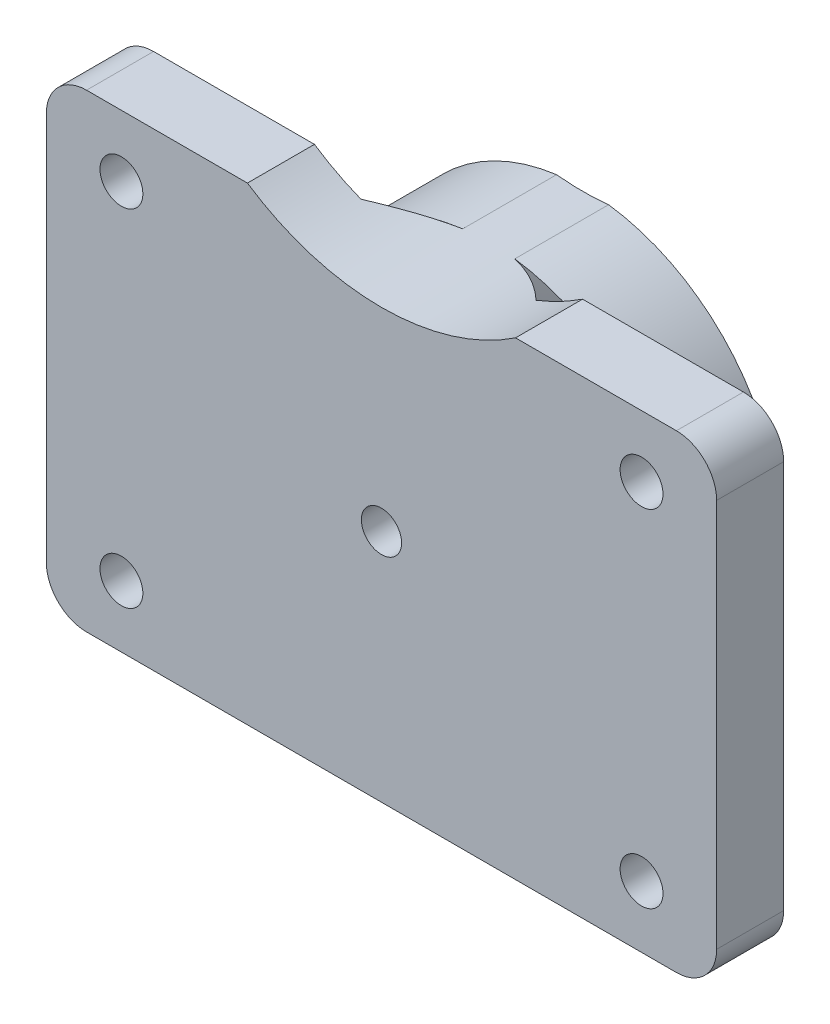
ISO-10303-21;
HEADER;
FILE_DESCRIPTION(('STEP AP214'),'2;1');
FILE_NAME('part.step','',(''),(''),'','','');
FILE_SCHEMA(('AUTOMOTIVE_DESIGN { 1 0 10303 214 1 1 1 1 }'));
ENDSEC;
DATA;
#1=APPLICATION_CONTEXT('core data for automotive mechanical design processes');
#2=APPLICATION_PROTOCOL_DEFINITION('international standard','automotive_design',2000,#1);
#3=PRODUCT_CONTEXT('',#1,'mechanical');
#4=PRODUCT('Part','Part','',(#3));
#5=PRODUCT_RELATED_PRODUCT_CATEGORY('part','',(#4));
#6=PRODUCT_DEFINITION_FORMATION('','',#4);
#7=PRODUCT_DEFINITION_CONTEXT('part definition',#1,'design');
#8=PRODUCT_DEFINITION('design','',#6,#7);
#9=PRODUCT_DEFINITION_SHAPE('','',#8);
#10=(LENGTH_UNIT() NAMED_UNIT(*) SI_UNIT(.MILLI.,.METRE.));
#11=(NAMED_UNIT(*) PLANE_ANGLE_UNIT() SI_UNIT($,.RADIAN.));
#12=(NAMED_UNIT(*) SI_UNIT($,.STERADIAN.) SOLID_ANGLE_UNIT());
#13=UNCERTAINTY_MEASURE_WITH_UNIT(LENGTH_MEASURE(1.E-05),#10,'distance_accuracy_value','');
#14=(GEOMETRIC_REPRESENTATION_CONTEXT(3) GLOBAL_UNCERTAINTY_ASSIGNED_CONTEXT((#13)) GLOBAL_UNIT_ASSIGNED_CONTEXT((#10,
#11,#12)) REPRESENTATION_CONTEXT('',''));
#15=CARTESIAN_POINT('',(0.,0.,0.));
#16=DIRECTION('',(0.,0.,1.));
#17=DIRECTION('',(1.,0.,0.));
#18=AXIS2_PLACEMENT_3D('',#15,#16,#17);
#19=CARTESIAN_POINT('',(-22.,17.5,2.5));
#20=DIRECTION('',(0.,-1.,0.));
#21=DIRECTION('',(0.,0.,-1.));
#22=AXIS2_PLACEMENT_3D('',#19,#20,#21);
#23=PLANE('',#22);
#24=DIRECTION('',(-1.,0.,0.));
#25=VECTOR('',#24,1.);
#26=CARTESIAN_POINT('',(-22.,17.5,-2.5));
#27=LINE('',#26,#25);
#28=CARTESIAN_POINT('',(22.,17.5,-2.5));
#29=VERTEX_POINT('',#28);
#30=CARTESIAN_POINT('',(10.,17.5,-2.5));
#31=VERTEX_POINT('',#30);
#32=EDGE_CURVE('E182',#29,#31,#27,.T.);
#33=ORIENTED_EDGE('',*,*,#32,.T.);
#34=DIRECTION('',(0.,0.,1.));
#35=VECTOR('',#34,1.);
#36=CARTESIAN_POINT('',(10.,17.5,-22.5));
#37=LINE('',#36,#35);
#38=CARTESIAN_POINT('',(10.,17.5,2.5));
#39=VERTEX_POINT('',#38);
#40=EDGE_CURVE('E374',#31,#39,#37,.T.);
#41=ORIENTED_EDGE('',*,*,#40,.T.);
#42=DIRECTION('',(-1.,0.,0.));
#43=VECTOR('',#42,1.);
#44=CARTESIAN_POINT('',(-22.,17.5,2.5));
#45=LINE('',#44,#43);
#46=CARTESIAN_POINT('',(22.,17.5,2.5));
#47=VERTEX_POINT('',#46);
#48=EDGE_CURVE('E142',#47,#39,#45,.T.);
#49=ORIENTED_EDGE('',*,*,#48,.F.);
#50=DIRECTION('',(0.,0.,-1.));
#51=VECTOR('',#50,1.);
#52=CARTESIAN_POINT('',(22.,17.5,2.5));
#53=LINE('',#52,#51);
#54=EDGE_CURVE('E153',#47,#29,#53,.T.);
#55=ORIENTED_EDGE('',*,*,#54,.T.);
#56=EDGE_LOOP('',(#33,#41,#49,#55));
#57=FACE_BOUND('',#56,.T.);
#58=ADVANCED_FACE('F39',(#57),#23,.F.);
#59=CARTESIAN_POINT('',(-22.,-14.5,2.5));
#60=DIRECTION('',(0.,0.,-1.));
#61=DIRECTION('',(-1.,0.,0.));
#62=AXIS2_PLACEMENT_3D('',#59,#60,#61);
#63=PLANE('',#62);
#64=CARTESIAN_POINT('',(0.,0.,2.5));
#65=DIRECTION('',(0.,0.,-1.));
#66=DIRECTION('',(-1.,0.,0.));
#67=AXIS2_PLACEMENT_3D('',#64,#65,#66);
#68=CIRCLE('',#67,1.5);
#69=CARTESIAN_POINT('',(-1.5,0.,2.5));
#70=VERTEX_POINT('',#69);
#71=EDGE_CURVE('E351',#70,#70,#68,.T.);
#72=ORIENTED_EDGE('',*,*,#71,.T.);
#73=EDGE_LOOP('',(#72));
#74=FACE_BOUND('',#73,.T.);
#75=ORIENTED_EDGE('',*,*,#48,.T.);
#76=CARTESIAN_POINT('',(0.,32.4666295470958,2.5));
#77=DIRECTION('',(0.,0.,1.));
#78=DIRECTION('',(1.,0.,0.));
#79=AXIS2_PLACEMENT_3D('',#76,#77,#78);
#80=CIRCLE('',#79,18.);
#81=CARTESIAN_POINT('',(-10.,17.5,2.5));
#82=VERTEX_POINT('',#81);
#83=EDGE_CURVE('E138',#82,#39,#80,.T.);
#84=ORIENTED_EDGE('',*,*,#83,.F.);
#85=CARTESIAN_POINT('',(-22.,17.5,2.5));
#86=VERTEX_POINT('',#85);
#87=EDGE_CURVE('E128',#82,#86,#45,.T.);
#88=ORIENTED_EDGE('',*,*,#87,.T.);
#89=CARTESIAN_POINT('',(-22.,14.5,2.5));
#90=DIRECTION('',(0.,0.,1.));
#91=DIRECTION('',(-1.,0.,0.));
#92=AXIS2_PLACEMENT_3D('',#89,#90,#91);
#93=CIRCLE('',#92,3.);
#94=CARTESIAN_POINT('',(-25.,14.5,2.5));
#95=VERTEX_POINT('',#94);
#96=EDGE_CURVE('E134',#86,#95,#93,.T.);
#97=ORIENTED_EDGE('',*,*,#96,.T.);
#98=DIRECTION('',(0.,-1.,0.));
#99=VECTOR('',#98,1.);
#100=CARTESIAN_POINT('',(-25.,-14.5,2.5));
#101=LINE('',#100,#99);
#102=CARTESIAN_POINT('',(-25.,-14.5,2.5));
#103=VERTEX_POINT('',#102);
#104=EDGE_CURVE('E70',#95,#103,#101,.T.);
#105=ORIENTED_EDGE('',*,*,#104,.T.);
#106=CARTESIAN_POINT('',(-22.,-14.5,2.5));
#107=DIRECTION('',(0.,0.,1.));
#108=DIRECTION('',(-1.,0.,0.));
#109=AXIS2_PLACEMENT_3D('',#106,#107,#108);
#110=CIRCLE('',#109,3.);
#111=CARTESIAN_POINT('',(-22.,-17.5,2.5));
#112=VERTEX_POINT('',#111);
#113=EDGE_CURVE('E191',#103,#112,#110,.T.);
#114=ORIENTED_EDGE('',*,*,#113,.T.);
#115=DIRECTION('',(1.,0.,0.));
#116=VECTOR('',#115,1.);
#117=CARTESIAN_POINT('',(-22.,-17.5,2.5));
#118=LINE('',#117,#116);
#119=CARTESIAN_POINT('',(22.,-17.5,2.5));
#120=VERTEX_POINT('',#119);
#121=EDGE_CURVE('E112',#112,#120,#118,.T.);
#122=ORIENTED_EDGE('',*,*,#121,.T.);
#123=CARTESIAN_POINT('',(22.,-14.5,2.5));
#124=DIRECTION('',(0.,0.,1.));
#125=DIRECTION('',(1.,0.,0.));
#126=AXIS2_PLACEMENT_3D('',#123,#124,#125);
#127=CIRCLE('',#126,3.);
#128=CARTESIAN_POINT('',(25.,-14.5,2.5));
#129=VERTEX_POINT('',#128);
#130=EDGE_CURVE('E286',#120,#129,#127,.T.);
#131=ORIENTED_EDGE('',*,*,#130,.T.);
#132=DIRECTION('',(0.,1.,0.));
#133=VECTOR('',#132,1.);
#134=CARTESIAN_POINT('',(25.,-14.5,2.5));
#135=LINE('',#134,#133);
#136=CARTESIAN_POINT('',(25.,14.5,2.5));
#137=VERTEX_POINT('',#136);
#138=EDGE_CURVE('E298',#129,#137,#135,.T.);
#139=ORIENTED_EDGE('',*,*,#138,.T.);
#140=CARTESIAN_POINT('',(22.,14.5,2.5));
#141=DIRECTION('',(0.,0.,1.));
#142=DIRECTION('',(-1.,0.,0.));
#143=AXIS2_PLACEMENT_3D('',#140,#141,#142);
#144=CIRCLE('',#143,3.);
#145=EDGE_CURVE('E143',#137,#47,#144,.T.);
#146=ORIENTED_EDGE('',*,*,#145,.T.);
#147=EDGE_LOOP('',(#75,#84,#88,#97,#105,#114,#122,#131,#139,#146));
#148=FACE_BOUND('',#147,.T.);
#149=CARTESIAN_POINT('',(-19.4,12.9,2.5));
#150=DIRECTION('',(0.,0.,1.));
#151=DIRECTION('',(1.,0.,0.));
#152=AXIS2_PLACEMENT_3D('',#149,#150,#151);
#153=CIRCLE('',#152,1.6);
#154=CARTESIAN_POINT('',(-17.8,12.9,2.5));
#155=VERTEX_POINT('',#154);
#156=EDGE_CURVE('E170',#155,#155,#153,.T.);
#157=ORIENTED_EDGE('',*,*,#156,.F.);
#158=EDGE_LOOP('',(#157));
#159=FACE_BOUND('',#158,.T.);
#160=CARTESIAN_POINT('',(19.4,12.9,2.5));
#161=DIRECTION('',(0.,0.,1.));
#162=DIRECTION('',(-1.,0.,0.));
#163=AXIS2_PLACEMENT_3D('',#160,#161,#162);
#164=CIRCLE('',#163,1.6);
#165=CARTESIAN_POINT('',(17.8,12.9,2.5));
#166=VERTEX_POINT('',#165);
#167=EDGE_CURVE('E312',#166,#166,#164,.T.);
#168=ORIENTED_EDGE('',*,*,#167,.F.);
#169=EDGE_LOOP('',(#168));
#170=FACE_BOUND('',#169,.T.);
#171=CARTESIAN_POINT('',(19.4,-12.9,2.5));
#172=DIRECTION('',(0.,0.,1.));
#173=DIRECTION('',(1.,0.,0.));
#174=AXIS2_PLACEMENT_3D('',#171,#172,#173);
#175=CIRCLE('',#174,1.6);
#176=CARTESIAN_POINT('',(21.,-12.9,2.5));
#177=VERTEX_POINT('',#176);
#178=EDGE_CURVE('E320',#177,#177,#175,.T.);
#179=ORIENTED_EDGE('',*,*,#178,.F.);
#180=EDGE_LOOP('',(#179));
#181=FACE_BOUND('',#180,.T.);
#182=CARTESIAN_POINT('',(-19.3999999999999,-12.9,2.5));
#183=DIRECTION('',(0.,0.,1.));
#184=DIRECTION('',(-1.,0.,0.));
#185=AXIS2_PLACEMENT_3D('',#182,#183,#184);
#186=CIRCLE('',#185,1.6);
#187=CARTESIAN_POINT('',(-20.9999999999999,-12.9,2.5));
#188=VERTEX_POINT('',#187);
#189=EDGE_CURVE('E328',#188,#188,#186,.T.);
#190=ORIENTED_EDGE('',*,*,#189,.F.);
#191=EDGE_LOOP('',(#190));
#192=FACE_BOUND('',#191,.T.);
#193=ADVANCED_FACE('F131',(#74,#148,#159,#170,#181,#192),#63,.F.);
#194=CARTESIAN_POINT('',(-22.,-14.5,-2.5));
#195=DIRECTION('',(0.,0.,-1.));
#196=DIRECTION('',(-1.,0.,0.));
#197=AXIS2_PLACEMENT_3D('',#194,#195,#196);
#198=PLANE('',#197);
#199=CARTESIAN_POINT('',(0.,32.4666295470958,-2.5));
#200=DIRECTION('',(0.,0.,-1.));
#201=DIRECTION('',(-1.,0.,0.));
#202=AXIS2_PLACEMENT_3D('',#199,#200,#201);
#203=CIRCLE('',#202,18.);
#204=CARTESIAN_POINT('',(6.53367846649108,15.6942997835683,-2.5));
#205=VERTEX_POINT('',#204);
#206=EDGE_CURVE('E356',#31,#205,#203,.T.);
#207=ORIENTED_EDGE('',*,*,#206,.F.);
#208=ORIENTED_EDGE('',*,*,#32,.F.);
#209=CARTESIAN_POINT('',(22.,14.5,-2.5));
#210=DIRECTION('',(0.,0.,1.));
#211=DIRECTION('',(-1.,0.,0.));
#212=AXIS2_PLACEMENT_3D('',#209,#210,#211);
#213=CIRCLE('',#212,3.);
#214=CARTESIAN_POINT('',(25.,14.5,-2.5));
#215=VERTEX_POINT('',#214);
#216=EDGE_CURVE('E179',#215,#29,#213,.T.);
#217=ORIENTED_EDGE('',*,*,#216,.F.);
#218=DIRECTION('',(0.,1.,0.));
#219=VECTOR('',#218,1.);
#220=CARTESIAN_POINT('',(25.,-14.5,-2.5));
#221=LINE('',#220,#219);
#222=CARTESIAN_POINT('',(25.,-14.5,-2.5));
#223=VERTEX_POINT('',#222);
#224=EDGE_CURVE('E176',#223,#215,#221,.T.);
#225=ORIENTED_EDGE('',*,*,#224,.F.);
#226=CARTESIAN_POINT('',(22.,-14.5,-2.5));
#227=DIRECTION('',(0.,0.,1.));
#228=DIRECTION('',(1.,0.,0.));
#229=AXIS2_PLACEMENT_3D('',#226,#227,#228);
#230=CIRCLE('',#229,3.);
#231=CARTESIAN_POINT('',(22.,-17.5,-2.5));
#232=VERTEX_POINT('',#231);
#233=EDGE_CURVE('E173',#232,#223,#230,.T.);
#234=ORIENTED_EDGE('',*,*,#233,.F.);
#235=DIRECTION('',(1.,0.,0.));
#236=VECTOR('',#235,1.);
#237=CARTESIAN_POINT('',(-22.,-17.5,-2.5));
#238=LINE('',#237,#236);
#239=CARTESIAN_POINT('',(-22.,-17.5,-2.5));
#240=VERTEX_POINT('',#239);
#241=EDGE_CURVE('E169',#240,#232,#238,.T.);
#242=ORIENTED_EDGE('',*,*,#241,.F.);
#243=CARTESIAN_POINT('',(-22.,-14.5,-2.5));
#244=DIRECTION('',(0.,0.,1.));
#245=DIRECTION('',(-1.,0.,0.));
#246=AXIS2_PLACEMENT_3D('',#243,#244,#245);
#247=CIRCLE('',#246,3.);
#248=CARTESIAN_POINT('',(-25.,-14.5,-2.5));
#249=VERTEX_POINT('',#248);
#250=EDGE_CURVE('E165',#249,#240,#247,.T.);
#251=ORIENTED_EDGE('',*,*,#250,.F.);
#252=DIRECTION('',(0.,-1.,0.));
#253=VECTOR('',#252,1.);
#254=CARTESIAN_POINT('',(-25.,-14.5,-2.5));
#255=LINE('',#254,#253);
#256=CARTESIAN_POINT('',(-25.,14.5,-2.5));
#257=VERTEX_POINT('',#256);
#258=EDGE_CURVE('E103',#257,#249,#255,.T.);
#259=ORIENTED_EDGE('',*,*,#258,.F.);
#260=CARTESIAN_POINT('',(-22.,14.5,-2.5));
#261=DIRECTION('',(0.,0.,1.));
#262=DIRECTION('',(-1.,0.,0.));
#263=AXIS2_PLACEMENT_3D('',#260,#261,#262);
#264=CIRCLE('',#263,3.);
#265=CARTESIAN_POINT('',(-22.,17.5,-2.5));
#266=VERTEX_POINT('',#265);
#267=EDGE_CURVE('E186',#266,#257,#264,.T.);
#268=ORIENTED_EDGE('',*,*,#267,.F.);
#269=CARTESIAN_POINT('',(-10.,17.5,-2.5));
#270=VERTEX_POINT('',#269);
#271=EDGE_CURVE('E149',#270,#266,#27,.T.);
#272=ORIENTED_EDGE('',*,*,#271,.F.);
#273=CARTESIAN_POINT('',(-6.53367846649108,15.6942997835683,-2.5));
#274=VERTEX_POINT('',#273);
#275=EDGE_CURVE('E364',#274,#270,#203,.T.);
#276=ORIENTED_EDGE('',*,*,#275,.F.);
#277=CARTESIAN_POINT('',(0.,0.,-2.5));
#278=DIRECTION('',(0.,0.,-1.));
#279=DIRECTION('',(-1.,0.,0.));
#280=AXIS2_PLACEMENT_3D('',#277,#278,#279);
#281=CIRCLE('',#280,17.);
#282=EDGE_CURVE('E214',#205,#274,#281,.T.);
#283=ORIENTED_EDGE('',*,*,#282,.F.);
#284=EDGE_LOOP('',(#207,#208,#217,#225,#234,#242,#251,#259,#268,#272,#276,#283));
#285=FACE_BOUND('',#284,.T.);
#286=CARTESIAN_POINT('',(19.4,-12.9,-2.5));
#287=DIRECTION('',(0.,0.,1.));
#288=DIRECTION('',(1.,0.,0.));
#289=AXIS2_PLACEMENT_3D('',#286,#287,#288);
#290=CIRCLE('',#289,1.6);
#291=CARTESIAN_POINT('',(21.,-12.9,-2.5));
#292=VERTEX_POINT('',#291);
#293=EDGE_CURVE('E324',#292,#292,#290,.T.);
#294=ORIENTED_EDGE('',*,*,#293,.T.);
#295=EDGE_LOOP('',(#294));
#296=FACE_BOUND('',#295,.T.);
#297=CARTESIAN_POINT('',(-19.4,12.9,-2.5));
#298=DIRECTION('',(0.,0.,1.));
#299=DIRECTION('',(1.,0.,0.));
#300=AXIS2_PLACEMENT_3D('',#297,#298,#299);
#301=CIRCLE('',#300,1.6);
#302=CARTESIAN_POINT('',(-17.8,12.9,-2.5));
#303=VERTEX_POINT('',#302);
#304=EDGE_CURVE('E308',#303,#303,#301,.T.);
#305=ORIENTED_EDGE('',*,*,#304,.T.);
#306=EDGE_LOOP('',(#305));
#307=FACE_BOUND('',#306,.T.);
#308=CARTESIAN_POINT('',(19.4,12.9,-2.5));
#309=DIRECTION('',(0.,0.,1.));
#310=DIRECTION('',(-1.,0.,0.));
#311=AXIS2_PLACEMENT_3D('',#308,#309,#310);
#312=CIRCLE('',#311,1.6);
#313=CARTESIAN_POINT('',(17.8,12.9,-2.5));
#314=VERTEX_POINT('',#313);
#315=EDGE_CURVE('E316',#314,#314,#312,.T.);
#316=ORIENTED_EDGE('',*,*,#315,.T.);
#317=EDGE_LOOP('',(#316));
#318=FACE_BOUND('',#317,.T.);
#319=CARTESIAN_POINT('',(-19.3999999999999,-12.9,-2.5));
#320=DIRECTION('',(0.,0.,1.));
#321=DIRECTION('',(-1.,0.,0.));
#322=AXIS2_PLACEMENT_3D('',#319,#320,#321);
#323=CIRCLE('',#322,1.6);
#324=CARTESIAN_POINT('',(-20.9999999999999,-12.9,-2.5));
#325=VERTEX_POINT('',#324);
#326=EDGE_CURVE('E332',#325,#325,#323,.T.);
#327=ORIENTED_EDGE('',*,*,#326,.T.);
#328=EDGE_LOOP('',(#327));
#329=FACE_BOUND('',#328,.T.);
#330=ADVANCED_FACE('F243',(#285,#296,#307,#318,#329),#198,.T.);
#331=CARTESIAN_POINT('',(-22.,-14.5,2.5));
#332=DIRECTION('',(0.,0.,-1.));
#333=DIRECTION('',(-1.,0.,0.));
#334=AXIS2_PLACEMENT_3D('',#331,#332,#333);
#335=CYLINDRICAL_SURFACE('',#334,3.);
#336=ORIENTED_EDGE('',*,*,#250,.T.);
#337=DIRECTION('',(0.,0.,-1.));
#338=VECTOR('',#337,1.);
#339=CARTESIAN_POINT('',(-22.,-17.5,2.5));
#340=LINE('',#339,#338);
#341=EDGE_CURVE('E211',#112,#240,#340,.T.);
#342=ORIENTED_EDGE('',*,*,#341,.F.);
#343=ORIENTED_EDGE('',*,*,#113,.F.);
#344=DIRECTION('',(0.,0.,-1.));
#345=VECTOR('',#344,1.);
#346=CARTESIAN_POINT('',(-25.,-14.5,2.5));
#347=LINE('',#346,#345);
#348=EDGE_CURVE('E161',#103,#249,#347,.T.);
#349=ORIENTED_EDGE('',*,*,#348,.T.);
#350=EDGE_LOOP('',(#336,#342,#343,#349));
#351=FACE_BOUND('',#350,.T.);
#352=ADVANCED_FACE('F41',(#351),#335,.T.);
#353=CARTESIAN_POINT('',(-22.,-17.5,2.5));
#354=DIRECTION('',(0.,1.,0.));
#355=DIRECTION('',(0.,0.,1.));
#356=AXIS2_PLACEMENT_3D('',#353,#354,#355);
#357=PLANE('',#356);
#358=ORIENTED_EDGE('',*,*,#241,.T.);
#359=DIRECTION('',(0.,0.,-1.));
#360=VECTOR('',#359,1.);
#361=CARTESIAN_POINT('',(22.,-17.5,2.5));
#362=LINE('',#361,#360);
#363=EDGE_CURVE('E207',#120,#232,#362,.T.);
#364=ORIENTED_EDGE('',*,*,#363,.F.);
#365=ORIENTED_EDGE('',*,*,#121,.F.);
#366=ORIENTED_EDGE('',*,*,#341,.T.);
#367=EDGE_LOOP('',(#358,#364,#365,#366));
#368=FACE_BOUND('',#367,.T.);
#369=ADVANCED_FACE('F273',(#368),#357,.F.);
#370=CARTESIAN_POINT('',(22.,-14.5,2.5));
#371=DIRECTION('',(0.,0.,-1.));
#372=DIRECTION('',(-1.,0.,0.));
#373=AXIS2_PLACEMENT_3D('',#370,#371,#372);
#374=CYLINDRICAL_SURFACE('',#373,3.);
#375=ORIENTED_EDGE('',*,*,#233,.T.);
#376=DIRECTION('',(0.,0.,-1.));
#377=VECTOR('',#376,1.);
#378=CARTESIAN_POINT('',(25.,-14.5,2.5));
#379=LINE('',#378,#377);
#380=EDGE_CURVE('E203',#129,#223,#379,.T.);
#381=ORIENTED_EDGE('',*,*,#380,.F.);
#382=ORIENTED_EDGE('',*,*,#130,.F.);
#383=ORIENTED_EDGE('',*,*,#363,.T.);
#384=EDGE_LOOP('',(#375,#381,#382,#383));
#385=FACE_BOUND('',#384,.T.);
#386=ADVANCED_FACE('F268',(#385),#374,.T.);
#387=CARTESIAN_POINT('',(25.,-14.5,2.5));
#388=DIRECTION('',(-1.,0.,0.));
#389=DIRECTION('',(0.,0.,1.));
#390=AXIS2_PLACEMENT_3D('',#387,#388,#389);
#391=PLANE('',#390);
#392=ORIENTED_EDGE('',*,*,#224,.T.);
#393=DIRECTION('',(0.,0.,-1.));
#394=VECTOR('',#393,1.);
#395=CARTESIAN_POINT('',(25.,14.5,2.5));
#396=LINE('',#395,#394);
#397=EDGE_CURVE('E199',#137,#215,#396,.T.);
#398=ORIENTED_EDGE('',*,*,#397,.F.);
#399=ORIENTED_EDGE('',*,*,#138,.F.);
#400=ORIENTED_EDGE('',*,*,#380,.T.);
#401=EDGE_LOOP('',(#392,#398,#399,#400));
#402=FACE_BOUND('',#401,.T.);
#403=ADVANCED_FACE('F263',(#402),#391,.F.);
#404=CARTESIAN_POINT('',(22.,14.5,2.5));
#405=DIRECTION('',(0.,0.,-1.));
#406=DIRECTION('',(-1.,0.,0.));
#407=AXIS2_PLACEMENT_3D('',#404,#405,#406);
#408=CYLINDRICAL_SURFACE('',#407,3.);
#409=ORIENTED_EDGE('',*,*,#216,.T.);
#410=ORIENTED_EDGE('',*,*,#54,.F.);
#411=ORIENTED_EDGE('',*,*,#145,.F.);
#412=ORIENTED_EDGE('',*,*,#397,.T.);
#413=EDGE_LOOP('',(#409,#410,#411,#412));
#414=FACE_BOUND('',#413,.T.);
#415=ADVANCED_FACE('F257',(#414),#408,.T.);
#416=ORIENTED_EDGE('',*,*,#87,.F.);
#417=DIRECTION('',(0.,0.,1.));
#418=VECTOR('',#417,1.);
#419=CARTESIAN_POINT('',(-10.,17.5,-22.5));
#420=LINE('',#419,#418);
#421=EDGE_CURVE('E373',#270,#82,#420,.T.);
#422=ORIENTED_EDGE('',*,*,#421,.F.);
#423=ORIENTED_EDGE('',*,*,#271,.T.);
#424=DIRECTION('',(0.,0.,-1.));
#425=VECTOR('',#424,1.);
#426=CARTESIAN_POINT('',(-22.,17.5,2.5));
#427=LINE('',#426,#425);
#428=EDGE_CURVE('E146',#86,#266,#427,.T.);
#429=ORIENTED_EDGE('',*,*,#428,.F.);
#430=EDGE_LOOP('',(#416,#422,#423,#429));
#431=FACE_BOUND('',#430,.T.);
#432=ADVANCED_FACE('F147',(#431),#23,.F.);
#433=CARTESIAN_POINT('',(-22.,14.5,2.5));
#434=DIRECTION('',(0.,0.,-1.));
#435=DIRECTION('',(-1.,0.,0.));
#436=AXIS2_PLACEMENT_3D('',#433,#434,#435);
#437=CYLINDRICAL_SURFACE('',#436,3.);
#438=ORIENTED_EDGE('',*,*,#267,.T.);
#439=DIRECTION('',(0.,0.,-1.));
#440=VECTOR('',#439,1.);
#441=CARTESIAN_POINT('',(-25.,14.5,2.5));
#442=LINE('',#441,#440);
#443=EDGE_CURVE('E154',#95,#257,#442,.T.);
#444=ORIENTED_EDGE('',*,*,#443,.F.);
#445=ORIENTED_EDGE('',*,*,#96,.F.);
#446=ORIENTED_EDGE('',*,*,#428,.T.);
#447=EDGE_LOOP('',(#438,#444,#445,#446));
#448=FACE_BOUND('',#447,.T.);
#449=ADVANCED_FACE('F156',(#448),#437,.T.);
#450=CARTESIAN_POINT('',(-25.,-14.5,2.5));
#451=DIRECTION('',(1.,0.,0.));
#452=DIRECTION('',(0.,0.,-1.));
#453=AXIS2_PLACEMENT_3D('',#450,#451,#452);
#454=PLANE('',#453);
#455=ORIENTED_EDGE('',*,*,#258,.T.);
#456=ORIENTED_EDGE('',*,*,#348,.F.);
#457=ORIENTED_EDGE('',*,*,#104,.F.);
#458=ORIENTED_EDGE('',*,*,#443,.T.);
#459=EDGE_LOOP('',(#455,#456,#457,#458));
#460=FACE_BOUND('',#459,.T.);
#461=ADVANCED_FACE('F262',(#460),#454,.F.);
#462=CARTESIAN_POINT('',(-19.4,12.9,2.5));
#463=DIRECTION('',(0.,0.,-1.));
#464=DIRECTION('',(-1.,0.,0.));
#465=AXIS2_PLACEMENT_3D('',#462,#463,#464);
#466=CYLINDRICAL_SURFACE('',#465,1.6);
#467=ORIENTED_EDGE('',*,*,#156,.T.);
#468=EDGE_LOOP('',(#467));
#469=FACE_BOUND('',#468,.T.);
#470=ORIENTED_EDGE('',*,*,#304,.F.);
#471=EDGE_LOOP('',(#470));
#472=FACE_BOUND('',#471,.T.);
#473=ADVANCED_FACE('F415',(#469,#472),#466,.F.);
#474=CARTESIAN_POINT('',(19.4,12.9,2.5));
#475=DIRECTION('',(0.,0.,-1.));
#476=DIRECTION('',(-1.,0.,0.));
#477=AXIS2_PLACEMENT_3D('',#474,#475,#476);
#478=CYLINDRICAL_SURFACE('',#477,1.6);
#479=ORIENTED_EDGE('',*,*,#167,.T.);
#480=EDGE_LOOP('',(#479));
#481=FACE_BOUND('',#480,.T.);
#482=ORIENTED_EDGE('',*,*,#315,.F.);
#483=EDGE_LOOP('',(#482));
#484=FACE_BOUND('',#483,.T.);
#485=ADVANCED_FACE('F420',(#481,#484),#478,.F.);
#486=CARTESIAN_POINT('',(19.4,-12.9,2.5));
#487=DIRECTION('',(0.,0.,-1.));
#488=DIRECTION('',(-1.,0.,0.));
#489=AXIS2_PLACEMENT_3D('',#486,#487,#488);
#490=CYLINDRICAL_SURFACE('',#489,1.6);
#491=ORIENTED_EDGE('',*,*,#178,.T.);
#492=EDGE_LOOP('',(#491));
#493=FACE_BOUND('',#492,.T.);
#494=ORIENTED_EDGE('',*,*,#293,.F.);
#495=EDGE_LOOP('',(#494));
#496=FACE_BOUND('',#495,.T.);
#497=ADVANCED_FACE('F427',(#493,#496),#490,.F.);
#498=CARTESIAN_POINT('',(-19.3999999999999,-12.9,2.5));
#499=DIRECTION('',(0.,0.,-1.));
#500=DIRECTION('',(-1.,0.,0.));
#501=AXIS2_PLACEMENT_3D('',#498,#499,#500);
#502=CYLINDRICAL_SURFACE('',#501,1.6);
#503=ORIENTED_EDGE('',*,*,#189,.T.);
#504=EDGE_LOOP('',(#503));
#505=FACE_BOUND('',#504,.T.);
#506=ORIENTED_EDGE('',*,*,#326,.F.);
#507=EDGE_LOOP('',(#506));
#508=FACE_BOUND('',#507,.T.);
#509=ADVANCED_FACE('F431',(#505,#508),#502,.F.);
#510=CARTESIAN_POINT('',(0.,0.,7.41758007255311));
#511=DIRECTION('',(0.,0.,1.));
#512=DIRECTION('',(1.,0.,0.));
#513=AXIS2_PLACEMENT_3D('',#510,#511,#512);
#514=CYLINDRICAL_SURFACE('',#513,8.2);
#515=CARTESIAN_POINT('',(0.,0.,-2.5));
#516=DIRECTION('',(0.,0.,-1.));
#517=DIRECTION('',(-1.,0.,0.));
#518=AXIS2_PLACEMENT_3D('',#515,#516,#517);
#519=CIRCLE('',#518,8.2);
#520=CARTESIAN_POINT('',(-8.2,0.,-2.5));
#521=VERTEX_POINT('',#520);
#522=EDGE_CURVE('E218',#521,#521,#519,.F.);
#523=ORIENTED_EDGE('',*,*,#522,.T.);
#524=EDGE_LOOP('',(#523));
#525=FACE_BOUND('',#524,.T.);
#526=CARTESIAN_POINT('',(0.,0.,-12.5));
#527=DIRECTION('',(0.,0.,1.));
#528=DIRECTION('',(1.,0.,0.));
#529=AXIS2_PLACEMENT_3D('',#526,#527,#528);
#530=CIRCLE('',#529,8.2);
#531=CARTESIAN_POINT('',(8.2,0.,-12.5));
#532=VERTEX_POINT('',#531);
#533=EDGE_CURVE('E336',#532,#532,#530,.T.);
#534=ORIENTED_EDGE('',*,*,#533,.F.);
#535=EDGE_LOOP('',(#534));
#536=FACE_BOUND('',#535,.T.);
#537=ADVANCED_FACE('F435',(#525,#536),#514,.F.);
#538=CARTESIAN_POINT('',(8.2,0.,-12.5));
#539=DIRECTION('',(0.,0.,-1.));
#540=DIRECTION('',(-1.,0.,0.));
#541=AXIS2_PLACEMENT_3D('',#538,#539,#540);
#542=PLANE('',#541);
#543=CARTESIAN_POINT('',(0.,32.4666295470958,-12.5));
#544=DIRECTION('',(0.,0.,-1.));
#545=DIRECTION('',(-1.,0.,0.));
#546=AXIS2_PLACEMENT_3D('',#543,#544,#545);
#547=CIRCLE('',#546,18.);
#548=CARTESIAN_POINT('',(1.93977114231603,14.5714545572993,-12.5));
#549=VERTEX_POINT('',#548);
#550=CARTESIAN_POINT('',(-1.93977114231603,14.5714545572993,-12.5));
#551=VERTEX_POINT('',#550);
#552=EDGE_CURVE('E368',#549,#551,#547,.T.);
#553=ORIENTED_EDGE('',*,*,#552,.F.);
#554=CARTESIAN_POINT('',(0.,0.,-12.5));
#555=DIRECTION('',(0.,0.,1.));
#556=DIRECTION('',(1.,0.,0.));
#557=AXIS2_PLACEMENT_3D('',#554,#555,#556);
#558=CIRCLE('',#557,14.7);
#559=EDGE_CURVE('E343',#551,#549,#558,.T.);
#560=ORIENTED_EDGE('',*,*,#559,.F.);
#561=EDGE_LOOP('',(#553,#560));
#562=FACE_BOUND('',#561,.T.);
#563=ORIENTED_EDGE('',*,*,#533,.T.);
#564=EDGE_LOOP('',(#563));
#565=FACE_BOUND('',#564,.T.);
#566=ADVANCED_FACE('F407',(#562,#565),#542,.T.);
#567=CARTESIAN_POINT('',(0.,0.,7.41758007255311));
#568=DIRECTION('',(0.,0.,1.));
#569=DIRECTION('',(1.,0.,0.));
#570=AXIS2_PLACEMENT_3D('',#567,#568,#569);
#571=CYLINDRICAL_SURFACE('',#570,14.7);
#572=DIRECTION('',(0.,0.,1.));
#573=VECTOR('',#572,1.);
#574=CARTESIAN_POINT('',(-1.93977114231603,14.5714545572993,-10.));
#575=LINE('',#574,#573);
#576=CARTESIAN_POINT('',(-1.93977114231603,14.5714545572993,-5.5));
#577=VERTEX_POINT('',#576);
#578=EDGE_CURVE('E61',#551,#577,#575,.T.);
#579=ORIENTED_EDGE('',*,*,#578,.F.);
#580=ORIENTED_EDGE('',*,*,#559,.T.);
#581=DIRECTION('',(0.,0.,1.));
#582=VECTOR('',#581,1.);
#583=CARTESIAN_POINT('',(1.93977114231603,14.5714545572993,-10.));
#584=LINE('',#583,#582);
#585=CARTESIAN_POINT('',(1.93977114231603,14.5714545572993,-5.5));
#586=VERTEX_POINT('',#585);
#587=EDGE_CURVE('E360',#586,#549,#584,.F.);
#588=ORIENTED_EDGE('',*,*,#587,.F.);
#589=CARTESIAN_POINT('',(0.,0.,-5.5));
#590=DIRECTION('',(0.,0.,1.));
#591=DIRECTION('',(1.,0.,0.));
#592=AXIS2_PLACEMENT_3D('',#589,#590,#591);
#593=CIRCLE('',#592,14.7);
#594=EDGE_CURVE('E347',#577,#586,#593,.T.);
#595=ORIENTED_EDGE('',*,*,#594,.F.);
#596=EDGE_LOOP('',(#579,#580,#588,#595));
#597=FACE_BOUND('',#596,.T.);
#598=ADVANCED_FACE('F401',(#597),#571,.T.);
#599=CARTESIAN_POINT('',(0.,0.,-2.5));
#600=DIRECTION('',(0.,0.,1.));
#601=DIRECTION('',(1.,0.,0.));
#602=AXIS2_PLACEMENT_3D('',#599,#600,#601);
#603=CONICAL_SURFACE('',#602,17.,0.654082724414361);
#604=CARTESIAN_POINT('',(6.53388456649327,15.6943800714965,-2.4998));
#605=CARTESIAN_POINT('',(6.4203374268908,15.6501487247059,-2.60997961488894));
#606=CARTESIAN_POINT('',(6.30540260399189,15.606699199585,-2.71903678272984));
#607=CARTESIAN_POINT('',(6.07253883616563,15.5214335715394,-2.93461507689342));
#608=CARTESIAN_POINT('',(5.95460924573081,15.479617825784,-3.04113564671099));
#609=CARTESIAN_POINT('',(5.59530106186826,15.3564891392741,-3.35706476965877));
#610=CARTESIAN_POINT('',(5.34913591778442,15.277782296201,-3.5621229682298));
#611=CARTESIAN_POINT('',(4.84840142160968,15.1299750870091,-3.95249150560205));
#612=CARTESIAN_POINT('',(4.5941563101624,15.06069518882,-4.13814794672019));
#613=CARTESIAN_POINT('',(4.07083356910478,14.930927557544,-4.49021427814544));
#614=CARTESIAN_POINT('',(3.80177792023245,14.8704272551209,-4.65665161234927));
#615=CARTESIAN_POINT('',(3.3998090266227,14.7901618428029,-4.87985001381127));
#616=CARTESIAN_POINT('',(3.27325245651503,14.7662688047863,-4.94665658114184));
#617=CARTESIAN_POINT('',(3.01684922387535,14.7207687580113,-5.07447118960543));
#618=CARTESIAN_POINT('',(2.88700306212175,14.6991614038618,-5.13548010668296));
#619=CARTESIAN_POINT('',(2.62272537416763,14.6582225197327,-5.25155945024293));
#620=CARTESIAN_POINT('',(2.48826089274864,14.6389160264838,-5.30656407963232));
#621=CARTESIAN_POINT('',(2.21607569036013,14.6030385615885,-5.4091592882235));
#622=CARTESIAN_POINT('',(2.07835279456327,14.586469479485,-5.45674474495487));
#623=CARTESIAN_POINT('',(1.93913056367429,14.5713851325307,-5.5002));
#624=B_SPLINE_CURVE_WITH_KNOTS('',3,(#604,#605,#606,#607,#608,#609,#610,#611,#612,#613,#614,
#615,#616,#617,#618,#619,#620,#621,#622,#623),.UNSPECIFIED.,.F.,.F.,(4,2,2,2,2,2,2,2,2,4),(0.,
0.492824083257095,0.985755309397405,1.97480975842506,2.94107974917868,3.90595243211906,
4.34107843590918,4.77613859332535,5.21556826394107,5.6553000021272),.UNSPECIFIED.);
#625=EDGE_CURVE('E11',#205,#586,#624,.T.);
#626=ORIENTED_EDGE('',*,*,#625,.F.);
#627=ORIENTED_EDGE('',*,*,#282,.T.);
#628=CARTESIAN_POINT('',(-1.93913056367429,14.5713851325306,-5.5002));
#629=CARTESIAN_POINT('',(-2.22970898598074,14.6028798134953,-5.40944688539176));
#630=CARTESIAN_POINT('',(-2.51325094155851,14.6407555202272,-5.30098858019387));
#631=CARTESIAN_POINT('',(-3.06491037314731,14.7272942086614,-5.05582001647737));
#632=CARTESIAN_POINT('',(-3.33308305059288,14.7759150812171,-4.91922017951358));
#633=CARTESIAN_POINT('',(-3.85079119478822,14.881403686202,-4.62644551805464));
#634=CARTESIAN_POINT('',(-4.10055345697368,14.9381296777202,-4.47061237664426));
#635=CARTESIAN_POINT('',(-4.58724560920688,15.0591573046919,-4.14238559942344));
#636=CARTESIAN_POINT('',(-4.82416404707409,15.1234655437868,-3.96997755243994));
#637=CARTESIAN_POINT('',(-5.31437893348032,15.2669097872192,-3.59055897490433));
#638=CARTESIAN_POINT('',(-5.56613844946436,15.3468974299599,-3.38189464617672));
#639=CARTESIAN_POINT('',(-5.93494495544666,15.4727046966684,-3.05877815509028));
#640=CARTESIAN_POINT('',(-6.05695208224636,15.5158246876302,-2.94885346723679));
#641=CARTESIAN_POINT('',(-6.2977609463418,15.6038119150468,-2.72628463180868));
#642=CARTESIAN_POINT('',(-6.41656342660401,15.6486787405173,-2.61364112624226));
#643=CARTESIAN_POINT('',(-6.53388456649327,15.6943800714965,-2.4998));
#644=B_SPLINE_CURVE_WITH_KNOTS('',3,(#628,#629,#630,#631,#632,#633,#634,#635,#636,#637,#638,
#639,#640,#641,#642,#643),.UNSPECIFIED.,.F.,.F.,(4,2,2,2,2,2,2,4),(0.,0.916368604061435,
1.82920780560946,2.72768922284422,3.62695902065604,4.63612955619246,5.14545082691953,
5.6546529834523),.UNSPECIFIED.);
#645=EDGE_CURVE('E54',#577,#274,#644,.T.);
#646=ORIENTED_EDGE('',*,*,#645,.F.);
#647=ORIENTED_EDGE('',*,*,#594,.T.);
#648=EDGE_LOOP('',(#626,#627,#646,#647));
#649=FACE_BOUND('',#648,.T.);
#650=ADVANCED_FACE('F226',(#649),#603,.T.);
#651=CARTESIAN_POINT('',(0.,0.,-2.5));
#652=DIRECTION('',(0.,0.,-1.));
#653=DIRECTION('',(-1.,0.,0.));
#654=AXIS2_PLACEMENT_3D('',#651,#652,#653);
#655=CIRCLE('',#654,1.5);
#656=CARTESIAN_POINT('',(-1.5,0.,-2.5));
#657=VERTEX_POINT('',#656);
#658=EDGE_CURVE('E352',#657,#657,#655,.T.);
#659=ORIENTED_EDGE('',*,*,#658,.F.);
#660=EDGE_LOOP('',(#659));
#661=FACE_BOUND('',#660,.T.);
#662=ORIENTED_EDGE('',*,*,#522,.F.);
#663=EDGE_LOOP('',(#662));
#664=FACE_BOUND('',#663,.T.);
#665=ADVANCED_FACE('F236',(#661,#664),#198,.T.);
#666=CARTESIAN_POINT('',(0.,0.,2.5));
#667=DIRECTION('',(0.,0.,-1.));
#668=DIRECTION('',(-1.,0.,0.));
#669=AXIS2_PLACEMENT_3D('',#666,#667,#668);
#670=CYLINDRICAL_SURFACE('',#669,1.5);
#671=ORIENTED_EDGE('',*,*,#71,.F.);
#672=EDGE_LOOP('',(#671));
#673=FACE_BOUND('',#672,.T.);
#674=ORIENTED_EDGE('',*,*,#658,.T.);
#675=EDGE_LOOP('',(#674));
#676=FACE_BOUND('',#675,.T.);
#677=ADVANCED_FACE('F233',(#673,#676),#670,.F.);
#678=CARTESIAN_POINT('',(0.,32.4666295470958,-22.5));
#679=DIRECTION('',(0.,0.,1.));
#680=DIRECTION('',(1.,0.,0.));
#681=AXIS2_PLACEMENT_3D('',#678,#679,#680);
#682=CYLINDRICAL_SURFACE('',#681,18.);
#683=ORIENTED_EDGE('',*,*,#206,.T.);
#684=ORIENTED_EDGE('',*,*,#625,.T.);
#685=ORIENTED_EDGE('',*,*,#587,.T.);
#686=ORIENTED_EDGE('',*,*,#552,.T.);
#687=ORIENTED_EDGE('',*,*,#578,.T.);
#688=ORIENTED_EDGE('',*,*,#645,.T.);
#689=ORIENTED_EDGE('',*,*,#275,.T.);
#690=ORIENTED_EDGE('',*,*,#421,.T.);
#691=ORIENTED_EDGE('',*,*,#83,.T.);
#692=ORIENTED_EDGE('',*,*,#40,.F.);
#693=EDGE_LOOP('',(#683,#684,#685,#686,#687,#688,#689,#690,#691,#692));
#694=FACE_BOUND('',#693,.T.);
#695=ADVANCED_FACE('F230',(#694),#682,.F.);
#696=CLOSED_SHELL('',(#58,#193,#330,#352,#369,#386,#403,#415,#432,#449,#461,#473,#485,#497,#509,
#537,#566,#598,#650,#665,#677,#695));
#697=MANIFOLD_SOLID_BREP('B2',#696);
#698=ADVANCED_BREP_SHAPE_REPRESENTATION('',(#18,#697),#14);
#699=SHAPE_DEFINITION_REPRESENTATION(#9,#698);
ENDSEC;
END-ISO-10303-21;
